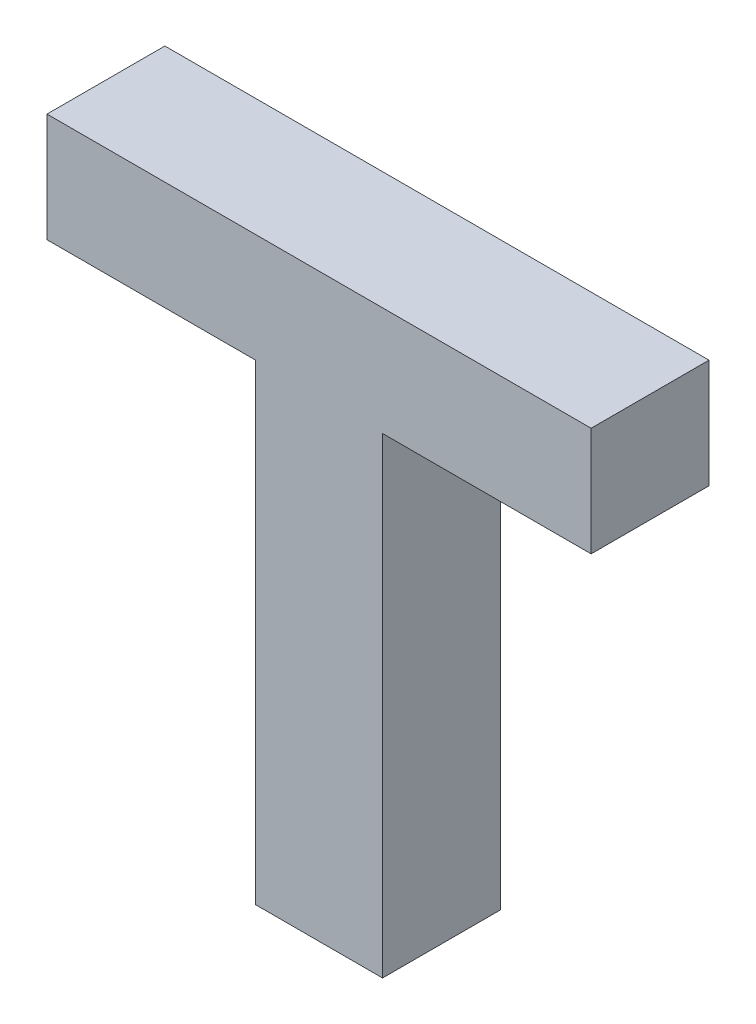
ISO-10303-21;
HEADER;
FILE_DESCRIPTION(('STEP AP214'),'2;1');
FILE_NAME('part.step','',(''),(''),'','','');
FILE_SCHEMA(('AUTOMOTIVE_DESIGN { 1 0 10303 214 1 1 1 1 }'));
ENDSEC;
DATA;
#1=APPLICATION_CONTEXT('core data for automotive mechanical design processes');
#2=APPLICATION_PROTOCOL_DEFINITION('international standard','automotive_design',2000,#1);
#3=PRODUCT_CONTEXT('',#1,'mechanical');
#4=PRODUCT('Part','Part','',(#3));
#5=PRODUCT_RELATED_PRODUCT_CATEGORY('part','',(#4));
#6=PRODUCT_DEFINITION_FORMATION('','',#4);
#7=PRODUCT_DEFINITION_CONTEXT('part definition',#1,'design');
#8=PRODUCT_DEFINITION('design','',#6,#7);
#9=PRODUCT_DEFINITION_SHAPE('','',#8);
#10=(LENGTH_UNIT() NAMED_UNIT(*) SI_UNIT(.MILLI.,.METRE.));
#11=(NAMED_UNIT(*) PLANE_ANGLE_UNIT() SI_UNIT($,.RADIAN.));
#12=(NAMED_UNIT(*) SI_UNIT($,.STERADIAN.) SOLID_ANGLE_UNIT());
#13=UNCERTAINTY_MEASURE_WITH_UNIT(LENGTH_MEASURE(1.E-05),#10,'distance_accuracy_value','');
#14=(GEOMETRIC_REPRESENTATION_CONTEXT(3) GLOBAL_UNCERTAINTY_ASSIGNED_CONTEXT((#13)) GLOBAL_UNIT_ASSIGNED_CONTEXT((#10,
#11,#12)) REPRESENTATION_CONTEXT('',''));
#15=CARTESIAN_POINT('',(0.,0.,0.));
#16=DIRECTION('',(0.,0.,1.));
#17=DIRECTION('',(1.,0.,0.));
#18=AXIS2_PLACEMENT_3D('',#15,#16,#17);
#19=CARTESIAN_POINT('',(0.,0.,6.5));
#20=DIRECTION('',(1.,0.,0.));
#21=DIRECTION('',(0.,1.,0.));
#22=AXIS2_PLACEMENT_3D('',#19,#20,#21);
#23=PLANE('',#22);
#24=DIRECTION('',(0.,-1.,0.));
#25=VECTOR('',#24,1.);
#26=CARTESIAN_POINT('',(0.,0.,0.));
#27=LINE('',#26,#25);
#28=CARTESIAN_POINT('',(0.,32.,0.));
#29=VERTEX_POINT('',#28);
#30=CARTESIAN_POINT('',(0.,26.,0.));
#31=VERTEX_POINT('',#30);
#32=EDGE_CURVE('E123',#29,#31,#27,.T.);
#33=ORIENTED_EDGE('',*,*,#32,.T.);
#34=DIRECTION('',(0.,0.,1.));
#35=VECTOR('',#34,1.);
#36=CARTESIAN_POINT('',(0.,26.,-0.00100000000000013));
#37=LINE('',#36,#35);
#38=CARTESIAN_POINT('',(0.,26.,6.5));
#39=VERTEX_POINT('',#38);
#40=EDGE_CURVE('E139',#31,#39,#37,.T.);
#41=ORIENTED_EDGE('',*,*,#40,.T.);
#42=DIRECTION('',(0.,-1.,0.));
#43=VECTOR('',#42,1.);
#44=CARTESIAN_POINT('',(0.,0.,6.5));
#45=LINE('',#44,#43);
#46=CARTESIAN_POINT('',(0.,32.,6.5));
#47=VERTEX_POINT('',#46);
#48=EDGE_CURVE('E120',#47,#39,#45,.T.);
#49=ORIENTED_EDGE('',*,*,#48,.F.);
#50=DIRECTION('',(0.,0.,-1.));
#51=VECTOR('',#50,1.);
#52=CARTESIAN_POINT('',(0.,32.,6.5));
#53=LINE('',#52,#51);
#54=EDGE_CURVE('E40',#47,#29,#53,.T.);
#55=ORIENTED_EDGE('',*,*,#54,.T.);
#56=EDGE_LOOP('',(#33,#41,#49,#55));
#57=FACE_BOUND('',#56,.T.);
#58=ADVANCED_FACE('F33',(#57),#23,.F.);
#59=CARTESIAN_POINT('',(0.,0.,6.5));
#60=DIRECTION('',(0.,1.,0.));
#61=DIRECTION('',(0.,0.,1.));
#62=AXIS2_PLACEMENT_3D('',#59,#60,#61);
#63=PLANE('',#62);
#64=DIRECTION('',(1.,0.,0.));
#65=VECTOR('',#64,1.);
#66=CARTESIAN_POINT('',(0.,0.,0.));
#67=LINE('',#66,#65);
#68=CARTESIAN_POINT('',(11.5,0.,0.));
#69=VERTEX_POINT('',#68);
#70=CARTESIAN_POINT('',(18.5,0.,0.));
#71=VERTEX_POINT('',#70);
#72=EDGE_CURVE('E118',#69,#71,#67,.T.);
#73=ORIENTED_EDGE('',*,*,#72,.T.);
#74=DIRECTION('',(0.,0.,1.));
#75=VECTOR('',#74,1.);
#76=CARTESIAN_POINT('',(18.5,0.,-0.00100000000000013));
#77=LINE('',#76,#75);
#78=CARTESIAN_POINT('',(18.5,0.,6.5));
#79=VERTEX_POINT('',#78);
#80=EDGE_CURVE('E104',#71,#79,#77,.T.);
#81=ORIENTED_EDGE('',*,*,#80,.T.);
#82=DIRECTION('',(1.,0.,0.));
#83=VECTOR('',#82,1.);
#84=CARTESIAN_POINT('',(0.,0.,6.5));
#85=LINE('',#84,#83);
#86=CARTESIAN_POINT('',(11.5,0.,6.5));
#87=VERTEX_POINT('',#86);
#88=EDGE_CURVE('E136',#87,#79,#85,.T.);
#89=ORIENTED_EDGE('',*,*,#88,.F.);
#90=DIRECTION('',(0.,0.,1.));
#91=VECTOR('',#90,1.);
#92=CARTESIAN_POINT('',(11.5,0.,-0.00100000000000013));
#93=LINE('',#92,#91);
#94=EDGE_CURVE('E142',#69,#87,#93,.T.);
#95=ORIENTED_EDGE('',*,*,#94,.F.);
#96=EDGE_LOOP('',(#73,#81,#89,#95));
#97=FACE_BOUND('',#96,.T.);
#98=ADVANCED_FACE('F159',(#97),#63,.F.);
#99=CARTESIAN_POINT('',(30.,0.,6.5));
#100=DIRECTION('',(-1.,0.,0.));
#101=DIRECTION('',(0.,-1.,0.));
#102=AXIS2_PLACEMENT_3D('',#99,#100,#101);
#103=PLANE('',#102);
#104=DIRECTION('',(0.,1.,0.));
#105=VECTOR('',#104,1.);
#106=CARTESIAN_POINT('',(30.,0.,6.5));
#107=LINE('',#106,#105);
#108=CARTESIAN_POINT('',(30.,26.,6.5));
#109=VERTEX_POINT('',#108);
#110=CARTESIAN_POINT('',(30.,32.,6.5));
#111=VERTEX_POINT('',#110);
#112=EDGE_CURVE('E111',#109,#111,#107,.T.);
#113=ORIENTED_EDGE('',*,*,#112,.F.);
#114=DIRECTION('',(0.,0.,1.));
#115=VECTOR('',#114,1.);
#116=CARTESIAN_POINT('',(30.,26.,-0.00100000000000013));
#117=LINE('',#116,#115);
#118=CARTESIAN_POINT('',(30.,26.,0.));
#119=VERTEX_POINT('',#118);
#120=EDGE_CURVE('E98',#119,#109,#117,.T.);
#121=ORIENTED_EDGE('',*,*,#120,.F.);
#122=DIRECTION('',(0.,1.,0.));
#123=VECTOR('',#122,1.);
#124=CARTESIAN_POINT('',(30.,0.,0.));
#125=LINE('',#124,#123);
#126=CARTESIAN_POINT('',(30.,32.,0.));
#127=VERTEX_POINT('',#126);
#128=EDGE_CURVE('E110',#119,#127,#125,.T.);
#129=ORIENTED_EDGE('',*,*,#128,.T.);
#130=DIRECTION('',(0.,0.,-1.));
#131=VECTOR('',#130,1.);
#132=CARTESIAN_POINT('',(30.,32.,6.5));
#133=LINE('',#132,#131);
#134=EDGE_CURVE('E11',#111,#127,#133,.T.);
#135=ORIENTED_EDGE('',*,*,#134,.F.);
#136=EDGE_LOOP('',(#113,#121,#129,#135));
#137=FACE_BOUND('',#136,.T.);
#138=ADVANCED_FACE('F108',(#137),#103,.F.);
#139=CARTESIAN_POINT('',(0.,32.,6.5));
#140=DIRECTION('',(0.,-1.,0.));
#141=DIRECTION('',(0.,0.,-1.));
#142=AXIS2_PLACEMENT_3D('',#139,#140,#141);
#143=PLANE('',#142);
#144=DIRECTION('',(-1.,0.,0.));
#145=VECTOR('',#144,1.);
#146=CARTESIAN_POINT('',(0.,32.,0.));
#147=LINE('',#146,#145);
#148=EDGE_CURVE('E117',#127,#29,#147,.T.);
#149=ORIENTED_EDGE('',*,*,#148,.T.);
#150=ORIENTED_EDGE('',*,*,#54,.F.);
#151=DIRECTION('',(-1.,0.,0.));
#152=VECTOR('',#151,1.);
#153=CARTESIAN_POINT('',(0.,32.,6.5));
#154=LINE('',#153,#152);
#155=EDGE_CURVE('E127',#111,#47,#154,.T.);
#156=ORIENTED_EDGE('',*,*,#155,.F.);
#157=ORIENTED_EDGE('',*,*,#134,.T.);
#158=EDGE_LOOP('',(#149,#150,#156,#157));
#159=FACE_BOUND('',#158,.T.);
#160=ADVANCED_FACE('F180',(#159),#143,.F.);
#161=CARTESIAN_POINT('',(0.,0.,6.5));
#162=DIRECTION('',(0.,0.,-1.));
#163=DIRECTION('',(-1.,0.,0.));
#164=AXIS2_PLACEMENT_3D('',#161,#162,#163);
#165=PLANE('',#164);
#166=ORIENTED_EDGE('',*,*,#88,.T.);
#167=DIRECTION('',(0.,-1.,0.));
#168=VECTOR('',#167,1.);
#169=CARTESIAN_POINT('',(18.5,0.,6.5));
#170=LINE('',#169,#168);
#171=CARTESIAN_POINT('',(18.5,26.,6.5));
#172=VERTEX_POINT('',#171);
#173=EDGE_CURVE('E112',#172,#79,#170,.T.);
#174=ORIENTED_EDGE('',*,*,#173,.F.);
#175=DIRECTION('',(-1.,0.,0.));
#176=VECTOR('',#175,1.);
#177=CARTESIAN_POINT('',(30.,26.,6.5));
#178=LINE('',#177,#176);
#179=EDGE_CURVE('E202',#109,#172,#178,.T.);
#180=ORIENTED_EDGE('',*,*,#179,.F.);
#181=ORIENTED_EDGE('',*,*,#112,.T.);
#182=ORIENTED_EDGE('',*,*,#155,.T.);
#183=ORIENTED_EDGE('',*,*,#48,.T.);
#184=DIRECTION('',(-1.,0.,0.));
#185=VECTOR('',#184,1.);
#186=CARTESIAN_POINT('',(0.,26.,6.5));
#187=LINE('',#186,#185);
#188=CARTESIAN_POINT('',(11.5,26.,6.5));
#189=VERTEX_POINT('',#188);
#190=EDGE_CURVE('E145',#189,#39,#187,.T.);
#191=ORIENTED_EDGE('',*,*,#190,.F.);
#192=DIRECTION('',(0.,1.,0.));
#193=VECTOR('',#192,1.);
#194=CARTESIAN_POINT('',(11.5,0.,6.5));
#195=LINE('',#194,#193);
#196=EDGE_CURVE('E155',#87,#189,#195,.T.);
#197=ORIENTED_EDGE('',*,*,#196,.F.);
#198=EDGE_LOOP('',(#166,#174,#180,#181,#182,#183,#191,#197));
#199=FACE_BOUND('',#198,.T.);
#200=ADVANCED_FACE('F153',(#199),#165,.F.);
#201=CARTESIAN_POINT('',(0.,0.,0.));
#202=DIRECTION('',(0.,0.,-1.));
#203=DIRECTION('',(-1.,0.,0.));
#204=AXIS2_PLACEMENT_3D('',#201,#202,#203);
#205=PLANE('',#204);
#206=DIRECTION('',(0.,-1.,0.));
#207=VECTOR('',#206,1.);
#208=CARTESIAN_POINT('',(18.5,0.,0.));
#209=LINE('',#208,#207);
#210=CARTESIAN_POINT('',(18.5,26.,0.));
#211=VERTEX_POINT('',#210);
#212=EDGE_CURVE('E201',#211,#71,#209,.T.);
#213=ORIENTED_EDGE('',*,*,#212,.T.);
#214=ORIENTED_EDGE('',*,*,#72,.F.);
#215=DIRECTION('',(0.,1.,0.));
#216=VECTOR('',#215,1.);
#217=CARTESIAN_POINT('',(11.5,0.,0.));
#218=LINE('',#217,#216);
#219=CARTESIAN_POINT('',(11.5,26.,0.));
#220=VERTEX_POINT('',#219);
#221=EDGE_CURVE('E103',#69,#220,#218,.T.);
#222=ORIENTED_EDGE('',*,*,#221,.T.);
#223=DIRECTION('',(-1.,0.,0.));
#224=VECTOR('',#223,1.);
#225=CARTESIAN_POINT('',(0.,26.,0.));
#226=LINE('',#225,#224);
#227=EDGE_CURVE('E169',#220,#31,#226,.T.);
#228=ORIENTED_EDGE('',*,*,#227,.T.);
#229=ORIENTED_EDGE('',*,*,#32,.F.);
#230=ORIENTED_EDGE('',*,*,#148,.F.);
#231=ORIENTED_EDGE('',*,*,#128,.F.);
#232=DIRECTION('',(-1.,0.,0.));
#233=VECTOR('',#232,1.);
#234=CARTESIAN_POINT('',(30.,26.,0.));
#235=LINE('',#234,#233);
#236=EDGE_CURVE('E95',#119,#211,#235,.T.);
#237=ORIENTED_EDGE('',*,*,#236,.T.);
#238=EDGE_LOOP('',(#213,#214,#222,#228,#229,#230,#231,#237));
#239=FACE_BOUND('',#238,.T.);
#240=ADVANCED_FACE('F115',(#239),#205,.T.);
#241=CARTESIAN_POINT('',(0.,26.,-0.00100000000000013));
#242=DIRECTION('',(0.,1.,0.));
#243=DIRECTION('',(0.,0.,1.));
#244=AXIS2_PLACEMENT_3D('',#241,#242,#243);
#245=PLANE('',#244);
#246=DIRECTION('',(0.,0.,1.));
#247=VECTOR('',#246,1.);
#248=CARTESIAN_POINT('',(11.5,26.,-0.00100000000000013));
#249=LINE('',#248,#247);
#250=EDGE_CURVE('E55',#220,#189,#249,.T.);
#251=ORIENTED_EDGE('',*,*,#250,.T.);
#252=ORIENTED_EDGE('',*,*,#190,.T.);
#253=ORIENTED_EDGE('',*,*,#40,.F.);
#254=ORIENTED_EDGE('',*,*,#227,.F.);
#255=EDGE_LOOP('',(#251,#252,#253,#254));
#256=FACE_BOUND('',#255,.T.);
#257=ADVANCED_FACE('F172',(#256),#245,.F.);
#258=CARTESIAN_POINT('',(11.5,0.,-0.00100000000000013));
#259=DIRECTION('',(1.,0.,0.));
#260=DIRECTION('',(0.,0.,-1.));
#261=AXIS2_PLACEMENT_3D('',#258,#259,#260);
#262=PLANE('',#261);
#263=ORIENTED_EDGE('',*,*,#94,.T.);
#264=ORIENTED_EDGE('',*,*,#196,.T.);
#265=ORIENTED_EDGE('',*,*,#250,.F.);
#266=ORIENTED_EDGE('',*,*,#221,.F.);
#267=EDGE_LOOP('',(#263,#264,#265,#266));
#268=FACE_BOUND('',#267,.T.);
#269=ADVANCED_FACE('F190',(#268),#262,.F.);
#270=CARTESIAN_POINT('',(18.5,0.,-0.00100000000000013));
#271=DIRECTION('',(-1.,0.,0.));
#272=DIRECTION('',(0.,0.,1.));
#273=AXIS2_PLACEMENT_3D('',#270,#271,#272);
#274=PLANE('',#273);
#275=DIRECTION('',(0.,0.,1.));
#276=VECTOR('',#275,1.);
#277=CARTESIAN_POINT('',(18.5,26.,-0.00100000000000013));
#278=LINE('',#277,#276);
#279=EDGE_CURVE('E47',#211,#172,#278,.T.);
#280=ORIENTED_EDGE('',*,*,#279,.T.);
#281=ORIENTED_EDGE('',*,*,#173,.T.);
#282=ORIENTED_EDGE('',*,*,#80,.F.);
#283=ORIENTED_EDGE('',*,*,#212,.F.);
#284=EDGE_LOOP('',(#280,#281,#282,#283));
#285=FACE_BOUND('',#284,.T.);
#286=ADVANCED_FACE('F193',(#285),#274,.F.);
#287=CARTESIAN_POINT('',(30.,26.,-0.00100000000000013));
#288=DIRECTION('',(0.,1.,0.));
#289=DIRECTION('',(0.,0.,1.));
#290=AXIS2_PLACEMENT_3D('',#287,#288,#289);
#291=PLANE('',#290);
#292=ORIENTED_EDGE('',*,*,#120,.T.);
#293=ORIENTED_EDGE('',*,*,#179,.T.);
#294=ORIENTED_EDGE('',*,*,#279,.F.);
#295=ORIENTED_EDGE('',*,*,#236,.F.);
#296=EDGE_LOOP('',(#292,#293,#294,#295));
#297=FACE_BOUND('',#296,.T.);
#298=ADVANCED_FACE('F97',(#297),#291,.F.);
#299=CLOSED_SHELL('',(#58,#98,#138,#160,#200,#240,#257,#269,#286,#298));
#300=MANIFOLD_SOLID_BREP('B2',#299);
#301=ADVANCED_BREP_SHAPE_REPRESENTATION('',(#18,#300),#14);
#302=SHAPE_DEFINITION_REPRESENTATION(#9,#301);
ENDSEC;
END-ISO-10303-21;
